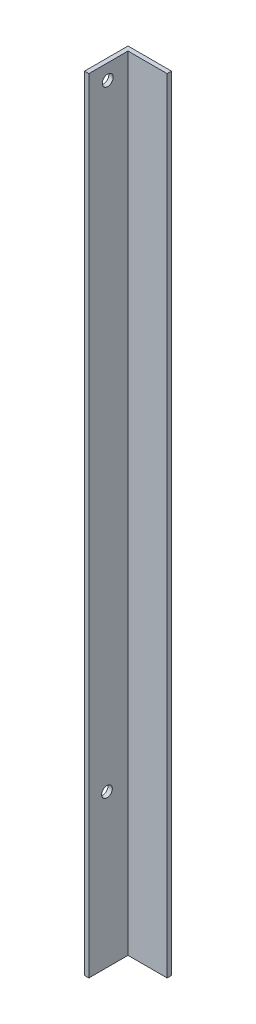
ISO-10303-21;
HEADER;
FILE_DESCRIPTION(('STEP AP214'),'2;1');
FILE_NAME('part.step','',(''),(''),'','','');
FILE_SCHEMA(('AUTOMOTIVE_DESIGN { 1 0 10303 214 1 1 1 1 }'));
ENDSEC;
DATA;
#1=APPLICATION_CONTEXT('core data for automotive mechanical design processes');
#2=APPLICATION_PROTOCOL_DEFINITION('international standard','automotive_design',2000,#1);
#3=PRODUCT_CONTEXT('',#1,'mechanical');
#4=PRODUCT('Part','Part','',(#3));
#5=PRODUCT_RELATED_PRODUCT_CATEGORY('part','',(#4));
#6=PRODUCT_DEFINITION_FORMATION('','',#4);
#7=PRODUCT_DEFINITION_CONTEXT('part definition',#1,'design');
#8=PRODUCT_DEFINITION('design','',#6,#7);
#9=PRODUCT_DEFINITION_SHAPE('','',#8);
#10=(LENGTH_UNIT() NAMED_UNIT(*) SI_UNIT(.MILLI.,.METRE.));
#11=(NAMED_UNIT(*) PLANE_ANGLE_UNIT() SI_UNIT($,.RADIAN.));
#12=(NAMED_UNIT(*) SI_UNIT($,.STERADIAN.) SOLID_ANGLE_UNIT());
#13=UNCERTAINTY_MEASURE_WITH_UNIT(LENGTH_MEASURE(1.E-05),#10,'distance_accuracy_value','');
#14=(GEOMETRIC_REPRESENTATION_CONTEXT(3) GLOBAL_UNCERTAINTY_ASSIGNED_CONTEXT((#13)) GLOBAL_UNIT_ASSIGNED_CONTEXT((#10,
#11,#12)) REPRESENTATION_CONTEXT('',''));
#15=CARTESIAN_POINT('',(0.,0.,0.));
#16=DIRECTION('',(0.,0.,1.));
#17=DIRECTION('',(1.,0.,0.));
#18=AXIS2_PLACEMENT_3D('',#15,#16,#17);
#19=CARTESIAN_POINT('',(-24.9936,457.2,-15.0368));
#20=DIRECTION('',(0.,0.,-1.));
#21=DIRECTION('',(-1.,0.,0.));
#22=AXIS2_PLACEMENT_3D('',#19,#20,#21);
#23=PLANE('',#22);
#24=DIRECTION('',(1.,0.,0.));
#25=VECTOR('',#24,1.);
#26=CARTESIAN_POINT('',(-24.9936,0.,-15.0368));
#27=LINE('',#26,#25);
#28=CARTESIAN_POINT('',(-22.4536,0.,-15.0368));
#29=VERTEX_POINT('',#28);
#30=CARTESIAN_POINT('',(0.406400000000005,0.,-15.0368));
#31=VERTEX_POINT('',#30);
#32=EDGE_CURVE('E113',#29,#31,#27,.T.);
#33=ORIENTED_EDGE('',*,*,#32,.T.);
#34=DIRECTION('',(0.,-1.,0.));
#35=VECTOR('',#34,1.);
#36=CARTESIAN_POINT('',(0.406400000000005,457.2,-15.0368));
#37=LINE('',#36,#35);
#38=CARTESIAN_POINT('',(0.406400000000005,457.2,-15.0368));
#39=VERTEX_POINT('',#38);
#40=EDGE_CURVE('E11',#39,#31,#37,.T.);
#41=ORIENTED_EDGE('',*,*,#40,.F.);
#42=DIRECTION('',(1.,0.,0.));
#43=VECTOR('',#42,1.);
#44=CARTESIAN_POINT('',(-24.9936,457.2,-15.0368));
#45=LINE('',#44,#43);
#46=CARTESIAN_POINT('',(-22.4536,457.2,-15.0368));
#47=VERTEX_POINT('',#46);
#48=EDGE_CURVE('E78',#47,#39,#45,.T.);
#49=ORIENTED_EDGE('',*,*,#48,.F.);
#50=DIRECTION('',(0.,-1.,0.));
#51=VECTOR('',#50,1.);
#52=CARTESIAN_POINT('',(-22.4536,457.2,-15.0368));
#53=LINE('',#52,#51);
#54=EDGE_CURVE('E109',#47,#29,#53,.T.);
#55=ORIENTED_EDGE('',*,*,#54,.T.);
#56=EDGE_LOOP('',(#33,#41,#49,#55));
#57=FACE_BOUND('',#56,.T.);
#58=ADVANCED_FACE('F32',(#57),#23,.F.);
#59=CARTESIAN_POINT('',(0.406400000000005,457.2,-17.5768));
#60=DIRECTION('',(1.,0.,0.));
#61=DIRECTION('',(0.,0.,-1.));
#62=AXIS2_PLACEMENT_3D('',#59,#60,#61);
#63=PLANE('',#62);
#64=DIRECTION('',(0.,0.,1.));
#65=VECTOR('',#64,1.);
#66=CARTESIAN_POINT('',(0.406400000000005,0.,-17.5768));
#67=LINE('',#66,#65);
#68=CARTESIAN_POINT('',(0.406400000000005,0.,-17.5768));
#69=VERTEX_POINT('',#68);
#70=EDGE_CURVE('E116',#69,#31,#67,.T.);
#71=ORIENTED_EDGE('',*,*,#70,.F.);
#72=DIRECTION('',(0.,-1.,0.));
#73=VECTOR('',#72,1.);
#74=CARTESIAN_POINT('',(0.406400000000005,457.2,-17.5768));
#75=LINE('',#74,#73);
#76=CARTESIAN_POINT('',(0.406400000000005,457.2,-17.5768));
#77=VERTEX_POINT('',#76);
#78=EDGE_CURVE('E40',#77,#69,#75,.T.);
#79=ORIENTED_EDGE('',*,*,#78,.F.);
#80=DIRECTION('',(0.,0.,1.));
#81=VECTOR('',#80,1.);
#82=CARTESIAN_POINT('',(0.406400000000005,457.2,-17.5768));
#83=LINE('',#82,#81);
#84=EDGE_CURVE('E182',#77,#39,#83,.T.);
#85=ORIENTED_EDGE('',*,*,#84,.T.);
#86=ORIENTED_EDGE('',*,*,#40,.T.);
#87=EDGE_LOOP('',(#71,#79,#85,#86));
#88=FACE_BOUND('',#87,.T.);
#89=ADVANCED_FACE('F135',(#88),#63,.T.);
#90=CARTESIAN_POINT('',(-24.9936,457.2,-17.5768));
#91=DIRECTION('',(0.,0.,-1.));
#92=DIRECTION('',(-1.,0.,0.));
#93=AXIS2_PLACEMENT_3D('',#90,#91,#92);
#94=PLANE('',#93);
#95=DIRECTION('',(1.,0.,0.));
#96=VECTOR('',#95,1.);
#97=CARTESIAN_POINT('',(-24.9936,0.,-17.5768));
#98=LINE('',#97,#96);
#99=CARTESIAN_POINT('',(-24.9936,0.,-17.5768));
#100=VERTEX_POINT('',#99);
#101=EDGE_CURVE('E120',#100,#69,#98,.T.);
#102=ORIENTED_EDGE('',*,*,#101,.F.);
#103=DIRECTION('',(0.,-1.,0.));
#104=VECTOR('',#103,1.);
#105=CARTESIAN_POINT('',(-24.9936,457.2,-17.5768));
#106=LINE('',#105,#104);
#107=CARTESIAN_POINT('',(-24.9936,457.2,-17.5768));
#108=VERTEX_POINT('',#107);
#109=EDGE_CURVE('E99',#108,#100,#106,.T.);
#110=ORIENTED_EDGE('',*,*,#109,.F.);
#111=DIRECTION('',(1.,0.,0.));
#112=VECTOR('',#111,1.);
#113=CARTESIAN_POINT('',(-24.9936,457.2,-17.5768));
#114=LINE('',#113,#112);
#115=EDGE_CURVE('E105',#108,#77,#114,.T.);
#116=ORIENTED_EDGE('',*,*,#115,.T.);
#117=ORIENTED_EDGE('',*,*,#78,.T.);
#118=EDGE_LOOP('',(#102,#110,#116,#117));
#119=FACE_BOUND('',#118,.T.);
#120=ADVANCED_FACE('F132',(#119),#94,.T.);
#121=CARTESIAN_POINT('',(-24.9936,457.2,7.8232));
#122=DIRECTION('',(-1.,0.,0.));
#123=DIRECTION('',(0.,0.,1.));
#124=AXIS2_PLACEMENT_3D('',#121,#122,#123);
#125=PLANE('',#124);
#126=CARTESIAN_POINT('',(-24.9936,88.9,-2.7617839705556));
#127=DIRECTION('',(1.,0.,0.));
#128=DIRECTION('',(0.,0.,-1.));
#129=AXIS2_PLACEMENT_3D('',#126,#127,#128);
#130=CIRCLE('',#129,3.11191963115221);
#131=CARTESIAN_POINT('',(-24.9936,88.9,-5.87370360170781));
#132=VERTEX_POINT('',#131);
#133=EDGE_CURVE('E169',#132,#132,#130,.T.);
#134=ORIENTED_EDGE('',*,*,#133,.T.);
#135=EDGE_LOOP('',(#134));
#136=FACE_BOUND('',#135,.T.);
#137=CARTESIAN_POINT('',(-24.9936,448.31,-3.20583492134574));
#138=DIRECTION('',(1.,0.,0.));
#139=DIRECTION('',(0.,0.,-1.));
#140=AXIS2_PLACEMENT_3D('',#137,#138,#139);
#141=CIRCLE('',#140,3.175);
#142=CARTESIAN_POINT('',(-24.9936,448.31,-6.38083492134574));
#143=VERTEX_POINT('',#142);
#144=EDGE_CURVE('E117',#143,#143,#141,.T.);
#145=ORIENTED_EDGE('',*,*,#144,.T.);
#146=EDGE_LOOP('',(#145));
#147=FACE_BOUND('',#146,.T.);
#148=DIRECTION('',(0.,0.,-1.));
#149=VECTOR('',#148,1.);
#150=CARTESIAN_POINT('',(-24.9936,0.,7.8232));
#151=LINE('',#150,#149);
#152=CARTESIAN_POINT('',(-24.9936,0.,7.8232));
#153=VERTEX_POINT('',#152);
#154=EDGE_CURVE('E94',#153,#100,#151,.T.);
#155=ORIENTED_EDGE('',*,*,#154,.F.);
#156=DIRECTION('',(0.,-1.,0.));
#157=VECTOR('',#156,1.);
#158=CARTESIAN_POINT('',(-24.9936,457.2,7.8232));
#159=LINE('',#158,#157);
#160=CARTESIAN_POINT('',(-24.9936,457.2,7.8232));
#161=VERTEX_POINT('',#160);
#162=EDGE_CURVE('E89',#161,#153,#159,.T.);
#163=ORIENTED_EDGE('',*,*,#162,.F.);
#164=DIRECTION('',(0.,0.,-1.));
#165=VECTOR('',#164,1.);
#166=CARTESIAN_POINT('',(-24.9936,457.2,7.8232));
#167=LINE('',#166,#165);
#168=EDGE_CURVE('E92',#161,#108,#167,.T.);
#169=ORIENTED_EDGE('',*,*,#168,.T.);
#170=ORIENTED_EDGE('',*,*,#109,.T.);
#171=EDGE_LOOP('',(#155,#163,#169,#170));
#172=FACE_BOUND('',#171,.T.);
#173=ADVANCED_FACE('F91',(#136,#147,#172),#125,.T.);
#174=CARTESIAN_POINT('',(-22.4536,457.2,7.8232));
#175=DIRECTION('',(0.,0.,1.));
#176=DIRECTION('',(1.,0.,0.));
#177=AXIS2_PLACEMENT_3D('',#174,#175,#176);
#178=PLANE('',#177);
#179=DIRECTION('',(-1.,0.,0.));
#180=VECTOR('',#179,1.);
#181=CARTESIAN_POINT('',(-22.4536,0.,7.8232));
#182=LINE('',#181,#180);
#183=CARTESIAN_POINT('',(-22.4536,0.,7.8232));
#184=VERTEX_POINT('',#183);
#185=EDGE_CURVE('E124',#184,#153,#182,.T.);
#186=ORIENTED_EDGE('',*,*,#185,.F.);
#187=DIRECTION('',(0.,-1.,0.));
#188=VECTOR('',#187,1.);
#189=CARTESIAN_POINT('',(-22.4536,457.2,7.8232));
#190=LINE('',#189,#188);
#191=CARTESIAN_POINT('',(-22.4536,457.2,7.8232));
#192=VERTEX_POINT('',#191);
#193=EDGE_CURVE('E69',#192,#184,#190,.T.);
#194=ORIENTED_EDGE('',*,*,#193,.F.);
#195=DIRECTION('',(-1.,0.,0.));
#196=VECTOR('',#195,1.);
#197=CARTESIAN_POINT('',(-22.4536,457.2,7.8232));
#198=LINE('',#197,#196);
#199=EDGE_CURVE('E103',#192,#161,#198,.T.);
#200=ORIENTED_EDGE('',*,*,#199,.T.);
#201=ORIENTED_EDGE('',*,*,#162,.T.);
#202=EDGE_LOOP('',(#186,#194,#200,#201));
#203=FACE_BOUND('',#202,.T.);
#204=ADVANCED_FACE('F107',(#203),#178,.T.);
#205=CARTESIAN_POINT('',(-22.4536,457.2,7.8232));
#206=DIRECTION('',(-1.,0.,0.));
#207=DIRECTION('',(0.,0.,1.));
#208=AXIS2_PLACEMENT_3D('',#205,#206,#207);
#209=PLANE('',#208);
#210=CARTESIAN_POINT('',(-22.4536,88.9,-2.7617839705556));
#211=DIRECTION('',(1.,0.,0.));
#212=DIRECTION('',(0.,0.,-1.));
#213=AXIS2_PLACEMENT_3D('',#210,#211,#212);
#214=CIRCLE('',#213,3.11191963115221);
#215=CARTESIAN_POINT('',(-22.4536,88.9,-5.87370360170781));
#216=VERTEX_POINT('',#215);
#217=EDGE_CURVE('E178',#216,#216,#214,.T.);
#218=ORIENTED_EDGE('',*,*,#217,.F.);
#219=EDGE_LOOP('',(#218));
#220=FACE_BOUND('',#219,.T.);
#221=CARTESIAN_POINT('',(-22.4536,448.31,-3.20583492134574));
#222=DIRECTION('',(1.,0.,0.));
#223=DIRECTION('',(0.,0.,-1.));
#224=AXIS2_PLACEMENT_3D('',#221,#222,#223);
#225=CIRCLE('',#224,3.175);
#226=CARTESIAN_POINT('',(-22.4536,448.31,-6.38083492134574));
#227=VERTEX_POINT('',#226);
#228=EDGE_CURVE('E173',#227,#227,#225,.T.);
#229=ORIENTED_EDGE('',*,*,#228,.F.);
#230=EDGE_LOOP('',(#229));
#231=FACE_BOUND('',#230,.T.);
#232=DIRECTION('',(0.,0.,-1.));
#233=VECTOR('',#232,1.);
#234=CARTESIAN_POINT('',(-22.4536,0.,7.8232));
#235=LINE('',#234,#233);
#236=EDGE_CURVE('E72',#184,#29,#235,.T.);
#237=ORIENTED_EDGE('',*,*,#236,.T.);
#238=ORIENTED_EDGE('',*,*,#54,.F.);
#239=DIRECTION('',(0.,0.,-1.));
#240=VECTOR('',#239,1.);
#241=CARTESIAN_POINT('',(-22.4536,457.2,7.8232));
#242=LINE('',#241,#240);
#243=EDGE_CURVE('E48',#192,#47,#242,.T.);
#244=ORIENTED_EDGE('',*,*,#243,.F.);
#245=ORIENTED_EDGE('',*,*,#193,.T.);
#246=EDGE_LOOP('',(#237,#238,#244,#245));
#247=FACE_BOUND('',#246,.T.);
#248=ADVANCED_FACE('F140',(#220,#231,#247),#209,.F.);
#249=CARTESIAN_POINT('',(0.,457.2,0.));
#250=DIRECTION('',(0.,-1.,0.));
#251=DIRECTION('',(-1.,0.,0.));
#252=AXIS2_PLACEMENT_3D('',#249,#250,#251);
#253=PLANE('',#252);
#254=ORIENTED_EDGE('',*,*,#48,.T.);
#255=ORIENTED_EDGE('',*,*,#84,.F.);
#256=ORIENTED_EDGE('',*,*,#115,.F.);
#257=ORIENTED_EDGE('',*,*,#168,.F.);
#258=ORIENTED_EDGE('',*,*,#199,.F.);
#259=ORIENTED_EDGE('',*,*,#243,.T.);
#260=EDGE_LOOP('',(#254,#255,#256,#257,#258,#259));
#261=FACE_BOUND('',#260,.T.);
#262=ADVANCED_FACE('F102',(#261),#253,.F.);
#263=CARTESIAN_POINT('',(0.,0.,0.));
#264=DIRECTION('',(0.,-1.,0.));
#265=DIRECTION('',(-1.,0.,0.));
#266=AXIS2_PLACEMENT_3D('',#263,#264,#265);
#267=PLANE('',#266);
#268=ORIENTED_EDGE('',*,*,#32,.F.);
#269=ORIENTED_EDGE('',*,*,#236,.F.);
#270=ORIENTED_EDGE('',*,*,#185,.T.);
#271=ORIENTED_EDGE('',*,*,#154,.T.);
#272=ORIENTED_EDGE('',*,*,#101,.T.);
#273=ORIENTED_EDGE('',*,*,#70,.T.);
#274=EDGE_LOOP('',(#268,#269,#270,#271,#272,#273));
#275=FACE_BOUND('',#274,.T.);
#276=ADVANCED_FACE('F138',(#275),#267,.T.);
#277=CARTESIAN_POINT('',(-24.9936,448.31,-3.20583492134574));
#278=DIRECTION('',(1.,0.,0.));
#279=DIRECTION('',(0.,0.,-1.));
#280=AXIS2_PLACEMENT_3D('',#277,#278,#279);
#281=CYLINDRICAL_SURFACE('',#280,3.175);
#282=ORIENTED_EDGE('',*,*,#144,.F.);
#283=EDGE_LOOP('',(#282));
#284=FACE_BOUND('',#283,.T.);
#285=ORIENTED_EDGE('',*,*,#228,.T.);
#286=EDGE_LOOP('',(#285));
#287=FACE_BOUND('',#286,.T.);
#288=ADVANCED_FACE('F187',(#284,#287),#281,.F.);
#289=CARTESIAN_POINT('',(-24.9936,88.9,-2.7617839705556));
#290=DIRECTION('',(1.,0.,0.));
#291=DIRECTION('',(0.,0.,-1.));
#292=AXIS2_PLACEMENT_3D('',#289,#290,#291);
#293=CYLINDRICAL_SURFACE('',#292,3.11191963115221);
#294=ORIENTED_EDGE('',*,*,#133,.F.);
#295=EDGE_LOOP('',(#294));
#296=FACE_BOUND('',#295,.T.);
#297=ORIENTED_EDGE('',*,*,#217,.T.);
#298=EDGE_LOOP('',(#297));
#299=FACE_BOUND('',#298,.T.);
#300=ADVANCED_FACE('F185',(#296,#299),#293,.F.);
#301=CLOSED_SHELL('',(#58,#89,#120,#173,#204,#248,#262,#276,#288,#300));
#302=MANIFOLD_SOLID_BREP('B2',#301);
#303=ADVANCED_BREP_SHAPE_REPRESENTATION('',(#18,#302),#14);
#304=SHAPE_DEFINITION_REPRESENTATION(#9,#303);
ENDSEC;
END-ISO-10303-21;
